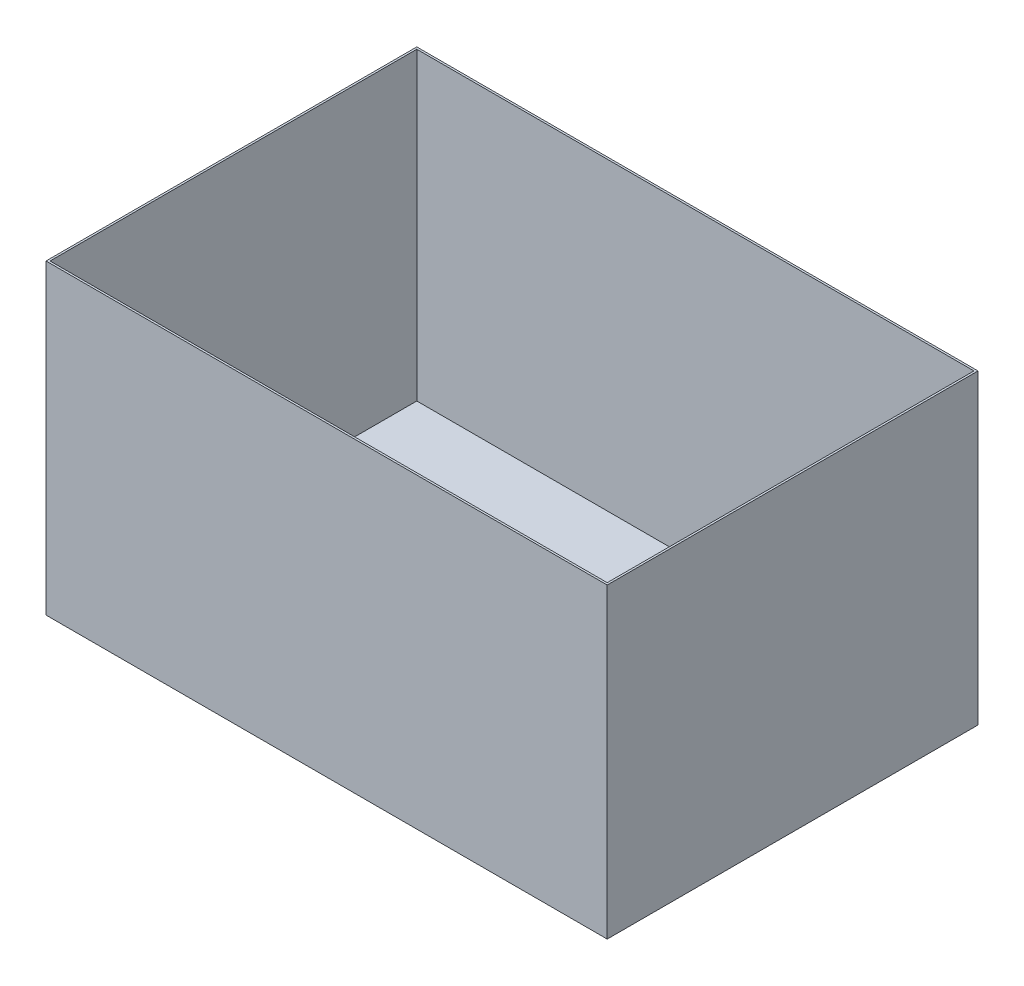
ISO-10303-21;
HEADER;
FILE_DESCRIPTION(('STEP AP214'),'2;1');
FILE_NAME('part.step','',(''),(''),'','','');
FILE_SCHEMA(('AUTOMOTIVE_DESIGN { 1 0 10303 214 1 1 1 1 }'));
ENDSEC;
DATA;
#1=APPLICATION_CONTEXT('core data for automotive mechanical design processes');
#2=APPLICATION_PROTOCOL_DEFINITION('international standard','automotive_design',2000,#1);
#3=PRODUCT_CONTEXT('',#1,'mechanical');
#4=PRODUCT('Part','Part','',(#3));
#5=PRODUCT_RELATED_PRODUCT_CATEGORY('part','',(#4));
#6=PRODUCT_DEFINITION_FORMATION('','',#4);
#7=PRODUCT_DEFINITION_CONTEXT('part definition',#1,'design');
#8=PRODUCT_DEFINITION('design','',#6,#7);
#9=PRODUCT_DEFINITION_SHAPE('','',#8);
#10=(LENGTH_UNIT() NAMED_UNIT(*) SI_UNIT(.MILLI.,.METRE.));
#11=(NAMED_UNIT(*) PLANE_ANGLE_UNIT() SI_UNIT($,.RADIAN.));
#12=(NAMED_UNIT(*) SI_UNIT($,.STERADIAN.) SOLID_ANGLE_UNIT());
#13=UNCERTAINTY_MEASURE_WITH_UNIT(LENGTH_MEASURE(1.E-05),#10,'distance_accuracy_value','');
#14=(GEOMETRIC_REPRESENTATION_CONTEXT(3) GLOBAL_UNCERTAINTY_ASSIGNED_CONTEXT((#13)) GLOBAL_UNIT_ASSIGNED_CONTEXT((#10,
#11,#12)) REPRESENTATION_CONTEXT('',''));
#15=CARTESIAN_POINT('',(0.,0.,0.));
#16=DIRECTION('',(0.,0.,1.));
#17=DIRECTION('',(1.,0.,0.));
#18=AXIS2_PLACEMENT_3D('',#15,#16,#17);
#19=CARTESIAN_POINT('',(-355.6,388.62,234.95));
#20=DIRECTION('',(0.,0.,-1.));
#21=DIRECTION('',(-1.,0.,0.));
#22=AXIS2_PLACEMENT_3D('',#19,#20,#21);
#23=PLANE('',#22);
#24=DIRECTION('',(1.,0.,0.));
#25=VECTOR('',#24,1.);
#26=CARTESIAN_POINT('',(-355.6,0.,234.95));
#27=LINE('',#26,#25);
#28=CARTESIAN_POINT('',(-355.6,0.,234.95));
#29=VERTEX_POINT('',#28);
#30=CARTESIAN_POINT('',(355.6,0.,234.95));
#31=VERTEX_POINT('',#30);
#32=EDGE_CURVE('E172',#29,#31,#27,.T.);
#33=ORIENTED_EDGE('',*,*,#32,.T.);
#34=DIRECTION('',(0.,-1.,0.));
#35=VECTOR('',#34,1.);
#36=CARTESIAN_POINT('',(355.6,388.62,234.95));
#37=LINE('',#36,#35);
#38=CARTESIAN_POINT('',(355.6,388.62,234.95));
#39=VERTEX_POINT('',#38);
#40=EDGE_CURVE('E11',#39,#31,#37,.T.);
#41=ORIENTED_EDGE('',*,*,#40,.F.);
#42=DIRECTION('',(1.,0.,0.));
#43=VECTOR('',#42,1.);
#44=CARTESIAN_POINT('',(-355.6,388.62,234.95));
#45=LINE('',#44,#43);
#46=CARTESIAN_POINT('',(-355.6,388.62,234.95));
#47=VERTEX_POINT('',#46);
#48=EDGE_CURVE('E159',#47,#39,#45,.T.);
#49=ORIENTED_EDGE('',*,*,#48,.F.);
#50=DIRECTION('',(0.,-1.,0.));
#51=VECTOR('',#50,1.);
#52=CARTESIAN_POINT('',(-355.6,388.62,234.95));
#53=LINE('',#52,#51);
#54=EDGE_CURVE('E66',#47,#29,#53,.T.);
#55=ORIENTED_EDGE('',*,*,#54,.T.);
#56=EDGE_LOOP('',(#33,#41,#49,#55));
#57=FACE_BOUND('',#56,.T.);
#58=ADVANCED_FACE('F42',(#57),#23,.F.);
#59=CARTESIAN_POINT('',(355.6,388.62,234.95));
#60=DIRECTION('',(-1.,0.,0.));
#61=DIRECTION('',(0.,0.,1.));
#62=AXIS2_PLACEMENT_3D('',#59,#60,#61);
#63=PLANE('',#62);
#64=DIRECTION('',(0.,0.,-1.));
#65=VECTOR('',#64,1.);
#66=CARTESIAN_POINT('',(355.6,0.,234.95));
#67=LINE('',#66,#65);
#68=CARTESIAN_POINT('',(355.6,0.,-234.95));
#69=VERTEX_POINT('',#68);
#70=EDGE_CURVE('E175',#31,#69,#67,.T.);
#71=ORIENTED_EDGE('',*,*,#70,.T.);
#72=DIRECTION('',(0.,-1.,0.));
#73=VECTOR('',#72,1.);
#74=CARTESIAN_POINT('',(355.6,388.62,-234.95));
#75=LINE('',#74,#73);
#76=CARTESIAN_POINT('',(355.6,388.62,-234.95));
#77=VERTEX_POINT('',#76);
#78=EDGE_CURVE('E50',#77,#69,#75,.T.);
#79=ORIENTED_EDGE('',*,*,#78,.F.);
#80=DIRECTION('',(0.,0.,-1.));
#81=VECTOR('',#80,1.);
#82=CARTESIAN_POINT('',(355.6,388.62,234.95));
#83=LINE('',#82,#81);
#84=EDGE_CURVE('E92',#39,#77,#83,.T.);
#85=ORIENTED_EDGE('',*,*,#84,.F.);
#86=ORIENTED_EDGE('',*,*,#40,.T.);
#87=EDGE_LOOP('',(#71,#79,#85,#86));
#88=FACE_BOUND('',#87,.T.);
#89=ADVANCED_FACE('F195',(#88),#63,.F.);
#90=CARTESIAN_POINT('',(-355.6,388.62,-234.95));
#91=DIRECTION('',(0.,0.,-1.));
#92=DIRECTION('',(-1.,0.,0.));
#93=AXIS2_PLACEMENT_3D('',#90,#91,#92);
#94=PLANE('',#93);
#95=DIRECTION('',(1.,0.,0.));
#96=VECTOR('',#95,1.);
#97=CARTESIAN_POINT('',(-355.6,0.,-234.95));
#98=LINE('',#97,#96);
#99=CARTESIAN_POINT('',(-355.6,0.,-234.95));
#100=VERTEX_POINT('',#99);
#101=EDGE_CURVE('E179',#100,#69,#98,.T.);
#102=ORIENTED_EDGE('',*,*,#101,.F.);
#103=DIRECTION('',(0.,-1.,0.));
#104=VECTOR('',#103,1.);
#105=CARTESIAN_POINT('',(-355.6,388.62,-234.95));
#106=LINE('',#105,#104);
#107=CARTESIAN_POINT('',(-355.6,388.62,-234.95));
#108=VERTEX_POINT('',#107);
#109=EDGE_CURVE('E188',#108,#100,#106,.T.);
#110=ORIENTED_EDGE('',*,*,#109,.F.);
#111=DIRECTION('',(1.,0.,0.));
#112=VECTOR('',#111,1.);
#113=CARTESIAN_POINT('',(-355.6,388.62,-234.95));
#114=LINE('',#113,#112);
#115=EDGE_CURVE('E165',#108,#77,#114,.T.);
#116=ORIENTED_EDGE('',*,*,#115,.T.);
#117=ORIENTED_EDGE('',*,*,#78,.T.);
#118=EDGE_LOOP('',(#102,#110,#116,#117));
#119=FACE_BOUND('',#118,.T.);
#120=ADVANCED_FACE('F193',(#119),#94,.T.);
#121=CARTESIAN_POINT('',(-355.6,388.62,234.95));
#122=DIRECTION('',(-1.,0.,0.));
#123=DIRECTION('',(0.,0.,1.));
#124=AXIS2_PLACEMENT_3D('',#121,#122,#123);
#125=PLANE('',#124);
#126=DIRECTION('',(0.,0.,-1.));
#127=VECTOR('',#126,1.);
#128=CARTESIAN_POINT('',(-355.6,0.,234.95));
#129=LINE('',#128,#127);
#130=EDGE_CURVE('E162',#29,#100,#129,.T.);
#131=ORIENTED_EDGE('',*,*,#130,.F.);
#132=ORIENTED_EDGE('',*,*,#54,.F.);
#133=DIRECTION('',(0.,0.,-1.));
#134=VECTOR('',#133,1.);
#135=CARTESIAN_POINT('',(-355.6,388.62,234.95));
#136=LINE('',#135,#134);
#137=EDGE_CURVE('E169',#47,#108,#136,.T.);
#138=ORIENTED_EDGE('',*,*,#137,.T.);
#139=ORIENTED_EDGE('',*,*,#109,.T.);
#140=EDGE_LOOP('',(#131,#132,#138,#139));
#141=FACE_BOUND('',#140,.T.);
#142=ADVANCED_FACE('F199',(#141),#125,.T.);
#143=CARTESIAN_POINT('',(0.,388.62,0.));
#144=DIRECTION('',(0.,1.,0.));
#145=DIRECTION('',(0.,0.,1.));
#146=AXIS2_PLACEMENT_3D('',#143,#144,#145);
#147=PLANE('',#146);
#148=DIRECTION('',(1.,0.,0.));
#149=VECTOR('',#148,1.);
#150=CARTESIAN_POINT('',(-355.6,388.62,232.41));
#151=LINE('',#150,#149);
#152=CARTESIAN_POINT('',(-353.06,388.62,232.41));
#153=VERTEX_POINT('',#152);
#154=CARTESIAN_POINT('',(353.06,388.62,232.41));
#155=VERTEX_POINT('',#154);
#156=EDGE_CURVE('E144',#153,#155,#151,.T.);
#157=ORIENTED_EDGE('',*,*,#156,.F.);
#158=DIRECTION('',(0.,0.,-1.));
#159=VECTOR('',#158,1.);
#160=CARTESIAN_POINT('',(-353.06,388.62,234.95));
#161=LINE('',#160,#159);
#162=CARTESIAN_POINT('',(-353.06,388.62,-232.41));
#163=VERTEX_POINT('',#162);
#164=EDGE_CURVE('E122',#153,#163,#161,.T.);
#165=ORIENTED_EDGE('',*,*,#164,.T.);
#166=DIRECTION('',(1.,0.,0.));
#167=VECTOR('',#166,1.);
#168=CARTESIAN_POINT('',(-355.6,388.62,-232.41));
#169=LINE('',#168,#167);
#170=CARTESIAN_POINT('',(353.06,388.62,-232.41));
#171=VERTEX_POINT('',#170);
#172=EDGE_CURVE('E57',#163,#171,#169,.T.);
#173=ORIENTED_EDGE('',*,*,#172,.T.);
#174=DIRECTION('',(0.,0.,-1.));
#175=VECTOR('',#174,1.);
#176=CARTESIAN_POINT('',(353.06,388.62,234.95));
#177=LINE('',#176,#175);
#178=EDGE_CURVE('E148',#155,#171,#177,.T.);
#179=ORIENTED_EDGE('',*,*,#178,.F.);
#180=EDGE_LOOP('',(#157,#165,#173,#179));
#181=FACE_BOUND('',#180,.T.);
#182=ORIENTED_EDGE('',*,*,#48,.T.);
#183=ORIENTED_EDGE('',*,*,#84,.T.);
#184=ORIENTED_EDGE('',*,*,#115,.F.);
#185=ORIENTED_EDGE('',*,*,#137,.F.);
#186=EDGE_LOOP('',(#182,#183,#184,#185));
#187=FACE_BOUND('',#186,.T.);
#188=ADVANCED_FACE('F202',(#181,#187),#147,.T.);
#189=CARTESIAN_POINT('',(0.,0.,0.));
#190=DIRECTION('',(0.,1.,0.));
#191=DIRECTION('',(0.,0.,1.));
#192=AXIS2_PLACEMENT_3D('',#189,#190,#191);
#193=PLANE('',#192);
#194=ORIENTED_EDGE('',*,*,#32,.F.);
#195=ORIENTED_EDGE('',*,*,#130,.T.);
#196=ORIENTED_EDGE('',*,*,#101,.T.);
#197=ORIENTED_EDGE('',*,*,#70,.F.);
#198=EDGE_LOOP('',(#194,#195,#196,#197));
#199=FACE_BOUND('',#198,.T.);
#200=ADVANCED_FACE('F198',(#199),#193,.F.);
#201=CARTESIAN_POINT('',(-355.6,388.62,232.41));
#202=DIRECTION('',(0.,0.,-1.));
#203=DIRECTION('',(-1.,0.,0.));
#204=AXIS2_PLACEMENT_3D('',#201,#202,#203);
#205=PLANE('',#204);
#206=DIRECTION('',(1.,0.,0.));
#207=VECTOR('',#206,1.);
#208=CARTESIAN_POINT('',(-355.6,2.53999999999999,232.41));
#209=LINE('',#208,#207);
#210=CARTESIAN_POINT('',(-353.06,2.54,232.41));
#211=VERTEX_POINT('',#210);
#212=CARTESIAN_POINT('',(353.06,2.54,232.41));
#213=VERTEX_POINT('',#212);
#214=EDGE_CURVE('E130',#211,#213,#209,.T.);
#215=ORIENTED_EDGE('',*,*,#214,.F.);
#216=DIRECTION('',(0.,-1.,0.));
#217=VECTOR('',#216,1.);
#218=CARTESIAN_POINT('',(-353.06,388.62,232.41));
#219=LINE('',#218,#217);
#220=EDGE_CURVE('E116',#153,#211,#219,.T.);
#221=ORIENTED_EDGE('',*,*,#220,.F.);
#222=ORIENTED_EDGE('',*,*,#156,.T.);
#223=DIRECTION('',(0.,-1.,0.));
#224=VECTOR('',#223,1.);
#225=CARTESIAN_POINT('',(353.06,388.62,232.41));
#226=LINE('',#225,#224);
#227=EDGE_CURVE('E133',#155,#213,#226,.T.);
#228=ORIENTED_EDGE('',*,*,#227,.T.);
#229=EDGE_LOOP('',(#215,#221,#222,#228));
#230=FACE_BOUND('',#229,.T.);
#231=ADVANCED_FACE('F131',(#230),#205,.T.);
#232=CARTESIAN_POINT('',(353.06,388.62,234.95));
#233=DIRECTION('',(-1.,0.,0.));
#234=DIRECTION('',(0.,0.,1.));
#235=AXIS2_PLACEMENT_3D('',#232,#233,#234);
#236=PLANE('',#235);
#237=DIRECTION('',(0.,0.,-1.));
#238=VECTOR('',#237,1.);
#239=CARTESIAN_POINT('',(353.06,2.53999999999999,234.95));
#240=LINE('',#239,#238);
#241=CARTESIAN_POINT('',(353.06,2.54,-232.41));
#242=VERTEX_POINT('',#241);
#243=EDGE_CURVE('E137',#213,#242,#240,.T.);
#244=ORIENTED_EDGE('',*,*,#243,.F.);
#245=ORIENTED_EDGE('',*,*,#227,.F.);
#246=ORIENTED_EDGE('',*,*,#178,.T.);
#247=DIRECTION('',(0.,-1.,0.));
#248=VECTOR('',#247,1.);
#249=CARTESIAN_POINT('',(353.06,388.62,-232.41));
#250=LINE('',#249,#248);
#251=EDGE_CURVE('E304',#171,#242,#250,.T.);
#252=ORIENTED_EDGE('',*,*,#251,.T.);
#253=EDGE_LOOP('',(#244,#245,#246,#252));
#254=FACE_BOUND('',#253,.T.);
#255=ADVANCED_FACE('F226',(#254),#236,.T.);
#256=CARTESIAN_POINT('',(-355.6,388.62,-232.41));
#257=DIRECTION('',(0.,0.,-1.));
#258=DIRECTION('',(-1.,0.,0.));
#259=AXIS2_PLACEMENT_3D('',#256,#257,#258);
#260=PLANE('',#259);
#261=DIRECTION('',(1.,0.,0.));
#262=VECTOR('',#261,1.);
#263=CARTESIAN_POINT('',(-355.6,2.53999999999999,-232.41));
#264=LINE('',#263,#262);
#265=CARTESIAN_POINT('',(-353.06,2.54,-232.41));
#266=VERTEX_POINT('',#265);
#267=EDGE_CURVE('E142',#266,#242,#264,.T.);
#268=ORIENTED_EDGE('',*,*,#267,.T.);
#269=ORIENTED_EDGE('',*,*,#251,.F.);
#270=ORIENTED_EDGE('',*,*,#172,.F.);
#271=DIRECTION('',(0.,-1.,0.));
#272=VECTOR('',#271,1.);
#273=CARTESIAN_POINT('',(-353.06,388.62,-232.41));
#274=LINE('',#273,#272);
#275=EDGE_CURVE('E126',#163,#266,#274,.T.);
#276=ORIENTED_EDGE('',*,*,#275,.T.);
#277=EDGE_LOOP('',(#268,#269,#270,#276));
#278=FACE_BOUND('',#277,.T.);
#279=ADVANCED_FACE('F223',(#278),#260,.F.);
#280=CARTESIAN_POINT('',(-353.06,388.62,234.95));
#281=DIRECTION('',(-1.,0.,0.));
#282=DIRECTION('',(0.,0.,1.));
#283=AXIS2_PLACEMENT_3D('',#280,#281,#282);
#284=PLANE('',#283);
#285=DIRECTION('',(0.,0.,-1.));
#286=VECTOR('',#285,1.);
#287=CARTESIAN_POINT('',(-353.06,2.53999999999999,234.95));
#288=LINE('',#287,#286);
#289=EDGE_CURVE('E120',#211,#266,#288,.T.);
#290=ORIENTED_EDGE('',*,*,#289,.T.);
#291=ORIENTED_EDGE('',*,*,#275,.F.);
#292=ORIENTED_EDGE('',*,*,#164,.F.);
#293=ORIENTED_EDGE('',*,*,#220,.T.);
#294=EDGE_LOOP('',(#290,#291,#292,#293));
#295=FACE_BOUND('',#294,.T.);
#296=ADVANCED_FACE('F118',(#295),#284,.F.);
#297=CARTESIAN_POINT('',(0.,2.54,0.));
#298=DIRECTION('',(0.,1.,0.));
#299=DIRECTION('',(0.,0.,1.));
#300=AXIS2_PLACEMENT_3D('',#297,#298,#299);
#301=PLANE('',#300);
#302=ORIENTED_EDGE('',*,*,#214,.T.);
#303=ORIENTED_EDGE('',*,*,#243,.T.);
#304=ORIENTED_EDGE('',*,*,#267,.F.);
#305=ORIENTED_EDGE('',*,*,#289,.F.);
#306=EDGE_LOOP('',(#302,#303,#304,#305));
#307=FACE_BOUND('',#306,.T.);
#308=ADVANCED_FACE('F140',(#307),#301,.T.);
#309=CLOSED_SHELL('',(#58,#89,#120,#142,#188,#200,#231,#255,#279,#296,#308));
#310=MANIFOLD_SOLID_BREP('B2',#309);
#311=ADVANCED_BREP_SHAPE_REPRESENTATION('',(#18,#310),#14);
#312=SHAPE_DEFINITION_REPRESENTATION(#9,#311);
ENDSEC;
END-ISO-10303-21;
